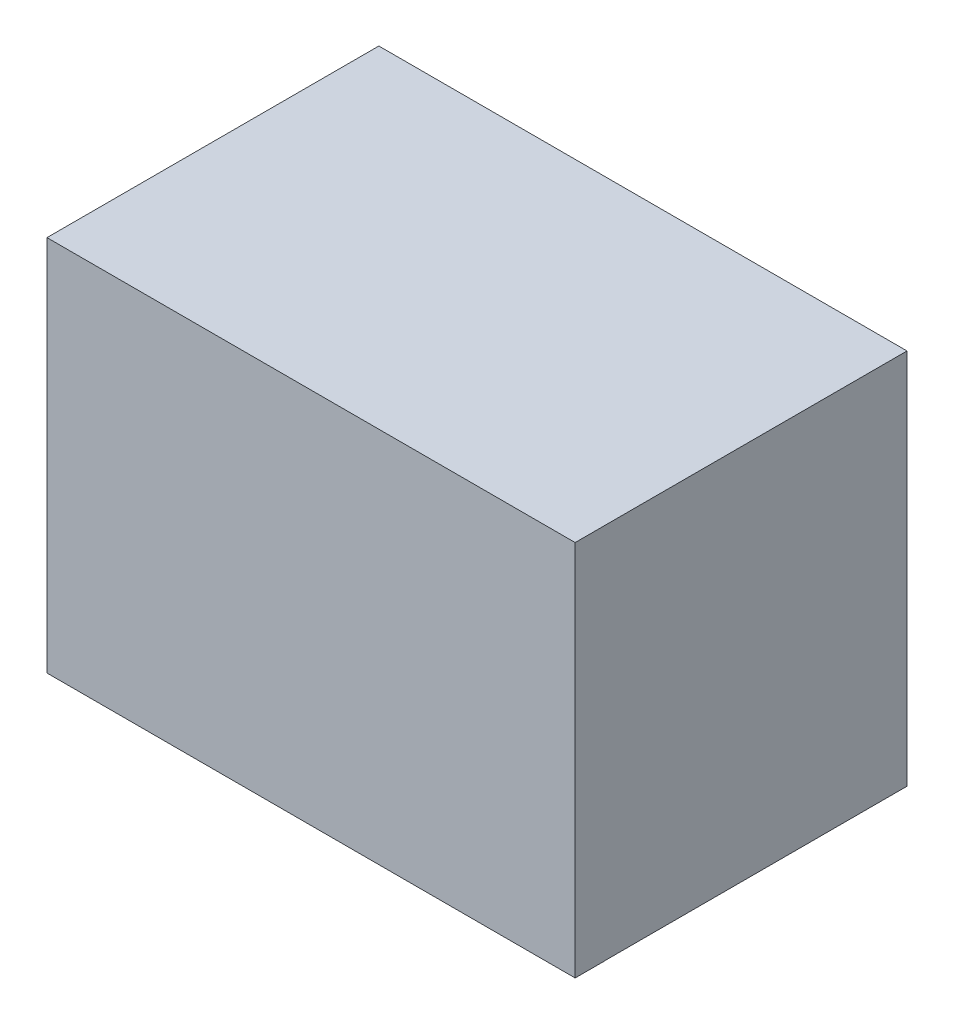
ISO-10303-21;
HEADER;
FILE_DESCRIPTION(('STEP AP214'),'2;1');
FILE_NAME('part.step','',(''),(''),'','','');
FILE_SCHEMA(('AUTOMOTIVE_DESIGN { 1 0 10303 214 1 1 1 1 }'));
ENDSEC;
DATA;
#1=APPLICATION_CONTEXT('core data for automotive mechanical design processes');
#2=APPLICATION_PROTOCOL_DEFINITION('international standard','automotive_design',2000,#1);
#3=PRODUCT_CONTEXT('',#1,'mechanical');
#4=PRODUCT('Part','Part','',(#3));
#5=PRODUCT_RELATED_PRODUCT_CATEGORY('part','',(#4));
#6=PRODUCT_DEFINITION_FORMATION('','',#4);
#7=PRODUCT_DEFINITION_CONTEXT('part definition',#1,'design');
#8=PRODUCT_DEFINITION('design','',#6,#7);
#9=PRODUCT_DEFINITION_SHAPE('','',#8);
#10=(LENGTH_UNIT() NAMED_UNIT(*) SI_UNIT(.MILLI.,.METRE.));
#11=(NAMED_UNIT(*) PLANE_ANGLE_UNIT() SI_UNIT($,.RADIAN.));
#12=(NAMED_UNIT(*) SI_UNIT($,.STERADIAN.) SOLID_ANGLE_UNIT());
#13=UNCERTAINTY_MEASURE_WITH_UNIT(LENGTH_MEASURE(1.E-05),#10,'distance_accuracy_value','');
#14=(GEOMETRIC_REPRESENTATION_CONTEXT(3) GLOBAL_UNCERTAINTY_ASSIGNED_CONTEXT((#13)) GLOBAL_UNIT_ASSIGNED_CONTEXT((#10,
#11,#12)) REPRESENTATION_CONTEXT('',''));
#15=CARTESIAN_POINT('',(0.,0.,0.));
#16=DIRECTION('',(0.,0.,1.));
#17=DIRECTION('',(1.,0.,0.));
#18=AXIS2_PLACEMENT_3D('',#15,#16,#17);
#19=CARTESIAN_POINT('',(-88.9354839762754,-63.4758614942647,-50.8));
#20=DIRECTION('',(-1.,0.,0.));
#21=DIRECTION('',(0.,0.,1.));
#22=AXIS2_PLACEMENT_3D('',#19,#20,#21);
#23=PLANE('',#22);
#24=DIRECTION('',(0.,0.,1.));
#25=VECTOR('',#24,1.);
#26=CARTESIAN_POINT('',(-88.9354839762754,-63.4758614942647,-50.8));
#27=LINE('',#26,#25);
#28=CARTESIAN_POINT('',(-88.9354839762754,-63.4758614942647,-50.8));
#29=VERTEX_POINT('',#28);
#30=CARTESIAN_POINT('',(-88.9354839762754,-63.4758614942647,50.8));
#31=VERTEX_POINT('',#30);
#32=EDGE_CURVE('E216',#29,#31,#27,.T.);
#33=ORIENTED_EDGE('',*,*,#32,.T.);
#34=DIRECTION('',(0.,1.,0.));
#35=VECTOR('',#34,1.);
#36=CARTESIAN_POINT('',(-88.9354839762754,-63.5241385057352,50.8));
#37=LINE('',#36,#35);
#38=CARTESIAN_POINT('',(-88.9354839762754,-63.5241385057352,50.8));
#39=VERTEX_POINT('',#38);
#40=EDGE_CURVE('E180',#39,#31,#37,.T.);
#41=ORIENTED_EDGE('',*,*,#40,.F.);
#42=DIRECTION('',(0.,0.,1.));
#43=VECTOR('',#42,1.);
#44=CARTESIAN_POINT('',(-88.9354839762754,-63.5241385057352,60.9633156210101));
#45=LINE('',#44,#43);
#46=CARTESIAN_POINT('',(-88.9354839762754,-63.5241385057352,60.9633156210101));
#47=VERTEX_POINT('',#46);
#48=EDGE_CURVE('E171',#39,#47,#45,.T.);
#49=ORIENTED_EDGE('',*,*,#48,.T.);
#50=DIRECTION('',(0.,1.,0.));
#51=VECTOR('',#50,1.);
#52=CARTESIAN_POINT('',(-88.9354839762754,-63.5241385057352,60.9633156210101));
#53=LINE('',#52,#51);
#54=CARTESIAN_POINT('',(-88.9354839762754,63.4758614942647,60.9633156210101));
#55=VERTEX_POINT('',#54);
#56=EDGE_CURVE('E155',#47,#55,#53,.T.);
#57=ORIENTED_EDGE('',*,*,#56,.T.);
#58=DIRECTION('',(0.,0.,1.));
#59=VECTOR('',#58,1.);
#60=CARTESIAN_POINT('',(-88.9354839762754,63.4758614942647,-50.8));
#61=LINE('',#60,#59);
#62=CARTESIAN_POINT('',(-88.9354839762754,63.4758614942647,-50.8));
#63=VERTEX_POINT('',#62);
#64=EDGE_CURVE('E221',#63,#55,#61,.T.);
#65=ORIENTED_EDGE('',*,*,#64,.F.);
#66=DIRECTION('',(0.,-1.,0.));
#67=VECTOR('',#66,1.);
#68=CARTESIAN_POINT('',(-88.9354839762754,-63.4758614942647,-50.8));
#69=LINE('',#68,#67);
#70=EDGE_CURVE('E206',#63,#29,#69,.T.);
#71=ORIENTED_EDGE('',*,*,#70,.T.);
#72=EDGE_LOOP('',(#33,#41,#49,#57,#65,#71));
#73=FACE_BOUND('',#72,.T.);
#74=ADVANCED_FACE('F39',(#73),#23,.T.);
#75=CARTESIAN_POINT('',(88.9354839762754,63.4758614942647,-50.8));
#76=DIRECTION('',(0.,1.,0.));
#77=DIRECTION('',(0.,0.,1.));
#78=AXIS2_PLACEMENT_3D('',#75,#76,#77);
#79=PLANE('',#78);
#80=ORIENTED_EDGE('',*,*,#64,.T.);
#81=DIRECTION('',(1.,0.,0.));
#82=VECTOR('',#81,1.);
#83=CARTESIAN_POINT('',(88.9354839762754,63.4758614942647,60.9633156210101));
#84=LINE('',#83,#82);
#85=CARTESIAN_POINT('',(88.9354839762754,63.4758614942647,60.9633156210101));
#86=VERTEX_POINT('',#85);
#87=EDGE_CURVE('E160',#55,#86,#84,.T.);
#88=ORIENTED_EDGE('',*,*,#87,.T.);
#89=DIRECTION('',(0.,0.,1.));
#90=VECTOR('',#89,1.);
#91=CARTESIAN_POINT('',(88.9354839762754,63.4758614942647,-50.8));
#92=LINE('',#91,#90);
#93=CARTESIAN_POINT('',(88.9354839762754,63.4758614942647,-50.8));
#94=VERTEX_POINT('',#93);
#95=EDGE_CURVE('E223',#94,#86,#92,.T.);
#96=ORIENTED_EDGE('',*,*,#95,.F.);
#97=DIRECTION('',(-1.,0.,0.));
#98=VECTOR('',#97,1.);
#99=CARTESIAN_POINT('',(88.9354839762754,63.4758614942647,-50.8));
#100=LINE('',#99,#98);
#101=EDGE_CURVE('E219',#94,#63,#100,.T.);
#102=ORIENTED_EDGE('',*,*,#101,.T.);
#103=EDGE_LOOP('',(#80,#88,#96,#102));
#104=FACE_BOUND('',#103,.T.);
#105=ADVANCED_FACE('F370',(#104),#79,.T.);
#106=CARTESIAN_POINT('',(88.9354839762754,-63.4758614942647,-50.8));
#107=DIRECTION('',(1.,0.,0.));
#108=DIRECTION('',(0.,0.,-1.));
#109=AXIS2_PLACEMENT_3D('',#106,#107,#108);
#110=PLANE('',#109);
#111=ORIENTED_EDGE('',*,*,#95,.T.);
#112=DIRECTION('',(0.,1.,0.));
#113=VECTOR('',#112,1.);
#114=CARTESIAN_POINT('',(88.9354839762754,-63.5241385057352,60.9633156210101));
#115=LINE('',#114,#113);
#116=CARTESIAN_POINT('',(88.9354839762754,-63.5241385057352,60.9633156210101));
#117=VERTEX_POINT('',#116);
#118=EDGE_CURVE('E161',#117,#86,#115,.T.);
#119=ORIENTED_EDGE('',*,*,#118,.F.);
#120=DIRECTION('',(0.,0.,-1.));
#121=VECTOR('',#120,1.);
#122=CARTESIAN_POINT('',(88.9354839762754,-63.5241385057352,60.9633156210101));
#123=LINE('',#122,#121);
#124=CARTESIAN_POINT('',(88.9354839762754,-63.5241385057352,50.8));
#125=VERTEX_POINT('',#124);
#126=EDGE_CURVE('E172',#117,#125,#123,.T.);
#127=ORIENTED_EDGE('',*,*,#126,.T.);
#128=DIRECTION('',(0.,1.,0.));
#129=VECTOR('',#128,1.);
#130=CARTESIAN_POINT('',(88.9354839762754,-63.5241385057352,50.8));
#131=LINE('',#130,#129);
#132=CARTESIAN_POINT('',(88.9354839762754,-63.4758614942647,50.8));
#133=VERTEX_POINT('',#132);
#134=EDGE_CURVE('E183',#125,#133,#131,.T.);
#135=ORIENTED_EDGE('',*,*,#134,.T.);
#136=DIRECTION('',(0.,0.,1.));
#137=VECTOR('',#136,1.);
#138=CARTESIAN_POINT('',(88.9354839762754,-63.4758614942647,-50.8));
#139=LINE('',#138,#137);
#140=CARTESIAN_POINT('',(88.9354839762754,-63.4758614942647,-50.8));
#141=VERTEX_POINT('',#140);
#142=EDGE_CURVE('E228',#141,#133,#139,.T.);
#143=ORIENTED_EDGE('',*,*,#142,.F.);
#144=DIRECTION('',(0.,1.,0.));
#145=VECTOR('',#144,1.);
#146=CARTESIAN_POINT('',(88.9354839762754,-63.4758614942647,-50.8));
#147=LINE('',#146,#145);
#148=EDGE_CURVE('E211',#141,#94,#147,.T.);
#149=ORIENTED_EDGE('',*,*,#148,.T.);
#150=EDGE_LOOP('',(#111,#119,#127,#135,#143,#149));
#151=FACE_BOUND('',#150,.T.);
#152=ADVANCED_FACE('F373',(#151),#110,.T.);
#153=CARTESIAN_POINT('',(88.9354839762754,-63.4758614942647,-50.8));
#154=DIRECTION('',(0.,-1.,0.));
#155=DIRECTION('',(0.,0.,-1.));
#156=AXIS2_PLACEMENT_3D('',#153,#154,#155);
#157=PLANE('',#156);
#158=ORIENTED_EDGE('',*,*,#142,.T.);
#159=DIRECTION('',(1.,0.,0.));
#160=VECTOR('',#159,1.);
#161=CARTESIAN_POINT('',(88.9354839762754,-63.4758614942647,50.8));
#162=LINE('',#161,#160);
#163=EDGE_CURVE('E205',#31,#133,#162,.T.);
#164=ORIENTED_EDGE('',*,*,#163,.F.);
#165=ORIENTED_EDGE('',*,*,#32,.F.);
#166=DIRECTION('',(1.,0.,0.));
#167=VECTOR('',#166,1.);
#168=CARTESIAN_POINT('',(88.9354839762754,-63.4758614942647,-50.8));
#169=LINE('',#168,#167);
#170=EDGE_CURVE('E212',#29,#141,#169,.T.);
#171=ORIENTED_EDGE('',*,*,#170,.T.);
#172=EDGE_LOOP('',(#158,#164,#165,#171));
#173=FACE_BOUND('',#172,.T.);
#174=ADVANCED_FACE('F377',(#173),#157,.T.);
#175=CARTESIAN_POINT('',(0.,0.,-50.8));
#176=DIRECTION('',(0.,0.,1.));
#177=DIRECTION('',(1.,0.,0.));
#178=AXIS2_PLACEMENT_3D('',#175,#176,#177);
#179=PLANE('',#178);
#180=CARTESIAN_POINT('',(-7.62,0.,-50.8));
#181=DIRECTION('',(0.,0.,1.));
#182=DIRECTION('',(1.,0.,0.));
#183=AXIS2_PLACEMENT_3D('',#180,#181,#182);
#184=CIRCLE('',#183,3.175);
#185=CARTESIAN_POINT('',(-4.445,0.,-50.8));
#186=VERTEX_POINT('',#185);
#187=EDGE_CURVE('E189',#186,#186,#184,.F.);
#188=ORIENTED_EDGE('',*,*,#187,.F.);
#189=EDGE_LOOP('',(#188));
#190=FACE_BOUND('',#189,.T.);
#191=CARTESIAN_POINT('',(-25.4,0.,-50.8));
#192=DIRECTION('',(0.,0.,1.));
#193=DIRECTION('',(1.,0.,0.));
#194=AXIS2_PLACEMENT_3D('',#191,#192,#193);
#195=CIRCLE('',#194,1.5875);
#196=CARTESIAN_POINT('',(-23.8125,0.,-50.8));
#197=VERTEX_POINT('',#196);
#198=EDGE_CURVE('E195',#197,#197,#195,.F.);
#199=ORIENTED_EDGE('',*,*,#198,.F.);
#200=EDGE_LOOP('',(#199));
#201=FACE_BOUND('',#200,.T.);
#202=ORIENTED_EDGE('',*,*,#70,.F.);
#203=ORIENTED_EDGE('',*,*,#101,.F.);
#204=ORIENTED_EDGE('',*,*,#148,.F.);
#205=ORIENTED_EDGE('',*,*,#170,.F.);
#206=EDGE_LOOP('',(#202,#203,#204,#205));
#207=FACE_BOUND('',#206,.T.);
#208=ADVANCED_FACE('F450',(#190,#201,#207),#179,.F.);
#209=CARTESIAN_POINT('',(76.2541872337562,-50.7409260868818,-38.0999999999999));
#210=DIRECTION('',(1.,0.,0.));
#211=DIRECTION('',(0.,0.,-1.));
#212=AXIS2_PLACEMENT_3D('',#209,#210,#211);
#213=PLANE('',#212);
#214=DIRECTION('',(0.,1.,0.));
#215=VECTOR('',#214,1.);
#216=CARTESIAN_POINT('',(76.2541872337562,-50.7409260868818,-25.3999999999999));
#217=LINE('',#216,#215);
#218=CARTESIAN_POINT('',(76.2541872337562,38.0409260868818,-25.3999999999999));
#219=VERTEX_POINT('',#218);
#220=CARTESIAN_POINT('',(76.2541872337562,-38.0409260868818,-25.3999999999999));
#221=VERTEX_POINT('',#220);
#222=EDGE_CURVE('E57',#219,#221,#217,.F.);
#223=ORIENTED_EDGE('',*,*,#222,.T.);
#224=DIRECTION('',(0.,0.,1.));
#225=VECTOR('',#224,1.);
#226=CARTESIAN_POINT('',(76.2541872337562,-38.0409260868818,50.8));
#227=LINE('',#226,#225);
#228=CARTESIAN_POINT('',(76.2541872337562,-38.0409260868818,50.8));
#229=VERTEX_POINT('',#228);
#230=EDGE_CURVE('E259',#221,#229,#227,.T.);
#231=ORIENTED_EDGE('',*,*,#230,.T.);
#232=DIRECTION('',(0.,1.,0.));
#233=VECTOR('',#232,1.);
#234=CARTESIAN_POINT('',(76.2541872337562,-50.7409260868818,50.8));
#235=LINE('',#234,#233);
#236=CARTESIAN_POINT('',(76.2541872337562,38.0409260868818,50.8));
#237=VERTEX_POINT('',#236);
#238=EDGE_CURVE('E198',#229,#237,#235,.T.);
#239=ORIENTED_EDGE('',*,*,#238,.T.);
#240=DIRECTION('',(0.,0.,1.));
#241=VECTOR('',#240,1.);
#242=CARTESIAN_POINT('',(76.2541872337562,38.0409260868818,-38.0999999999999));
#243=LINE('',#242,#241);
#244=EDGE_CURVE('E62',#237,#219,#243,.F.);
#245=ORIENTED_EDGE('',*,*,#244,.T.);
#246=EDGE_LOOP('',(#223,#231,#239,#245));
#247=FACE_BOUND('',#246,.T.);
#248=ADVANCED_FACE('F347',(#247),#213,.F.);
#249=CARTESIAN_POINT('',(-76.2541872337562,-50.7409260868818,-38.0999999999999));
#250=DIRECTION('',(0.,-1.,0.));
#251=DIRECTION('',(0.,0.,-1.));
#252=AXIS2_PLACEMENT_3D('',#249,#250,#251);
#253=PLANE('',#252);
#254=DIRECTION('',(1.,0.,0.));
#255=VECTOR('',#254,1.);
#256=CARTESIAN_POINT('',(-76.2541872337562,-50.7409260868818,-25.3999999999999));
#257=LINE('',#256,#255);
#258=CARTESIAN_POINT('',(63.5541872337562,-50.7409260868818,-25.3999999999999));
#259=VERTEX_POINT('',#258);
#260=CARTESIAN_POINT('',(-63.5541872337562,-50.7409260868818,-25.3999999999999));
#261=VERTEX_POINT('',#260);
#262=EDGE_CURVE('E229',#259,#261,#257,.F.);
#263=ORIENTED_EDGE('',*,*,#262,.T.);
#264=DIRECTION('',(0.,0.,1.));
#265=VECTOR('',#264,1.);
#266=CARTESIAN_POINT('',(-63.5541872337562,-50.7409260868818,50.8));
#267=LINE('',#266,#265);
#268=CARTESIAN_POINT('',(-63.5541872337562,-50.7409260868818,50.8));
#269=VERTEX_POINT('',#268);
#270=EDGE_CURVE('E235',#261,#269,#267,.T.);
#271=ORIENTED_EDGE('',*,*,#270,.T.);
#272=DIRECTION('',(1.,0.,0.));
#273=VECTOR('',#272,1.);
#274=CARTESIAN_POINT('',(-76.2541872337562,-50.7409260868818,50.8));
#275=LINE('',#274,#273);
#276=CARTESIAN_POINT('',(63.5541872337562,-50.7409260868818,50.8));
#277=VERTEX_POINT('',#276);
#278=EDGE_CURVE('E204',#269,#277,#275,.T.);
#279=ORIENTED_EDGE('',*,*,#278,.T.);
#280=DIRECTION('',(0.,0.,1.));
#281=VECTOR('',#280,1.);
#282=CARTESIAN_POINT('',(63.5541872337562,-50.7409260868818,-38.0999999999999));
#283=LINE('',#282,#281);
#284=EDGE_CURVE('E224',#277,#259,#283,.F.);
#285=ORIENTED_EDGE('',*,*,#284,.T.);
#286=EDGE_LOOP('',(#263,#271,#279,#285));
#287=FACE_BOUND('',#286,.T.);
#288=ADVANCED_FACE('F530',(#287),#253,.F.);
#289=CARTESIAN_POINT('',(-76.2541872337562,-50.7409260868818,-38.0999999999999));
#290=DIRECTION('',(-1.,0.,0.));
#291=DIRECTION('',(0.,0.,1.));
#292=AXIS2_PLACEMENT_3D('',#289,#290,#291);
#293=PLANE('',#292);
#294=DIRECTION('',(0.,-1.,0.));
#295=VECTOR('',#294,1.);
#296=CARTESIAN_POINT('',(-76.2541872337562,-50.7409260868818,50.8));
#297=LINE('',#296,#295);
#298=CARTESIAN_POINT('',(-76.2541872337562,38.0409260868818,50.8));
#299=VERTEX_POINT('',#298);
#300=CARTESIAN_POINT('',(-76.2541872337562,-38.0409260868818,50.8));
#301=VERTEX_POINT('',#300);
#302=EDGE_CURVE('E201',#299,#301,#297,.T.);
#303=ORIENTED_EDGE('',*,*,#302,.T.);
#304=DIRECTION('',(0.,0.,1.));
#305=VECTOR('',#304,1.);
#306=CARTESIAN_POINT('',(-76.2541872337562,-38.0409260868818,-38.0999999999999));
#307=LINE('',#306,#305);
#308=CARTESIAN_POINT('',(-76.2541872337562,-38.0409260868818,-25.3999999999999));
#309=VERTEX_POINT('',#308);
#310=EDGE_CURVE('E237',#301,#309,#307,.F.);
#311=ORIENTED_EDGE('',*,*,#310,.T.);
#312=DIRECTION('',(0.,-1.,0.));
#313=VECTOR('',#312,1.);
#314=CARTESIAN_POINT('',(-76.2541872337562,50.7409260868818,-25.3999999999999));
#315=LINE('',#314,#313);
#316=CARTESIAN_POINT('',(-76.2541872337562,38.0409260868818,-25.3999999999999));
#317=VERTEX_POINT('',#316);
#318=EDGE_CURVE('E240',#309,#317,#315,.F.);
#319=ORIENTED_EDGE('',*,*,#318,.T.);
#320=DIRECTION('',(0.,0.,1.));
#321=VECTOR('',#320,1.);
#322=CARTESIAN_POINT('',(-76.2541872337562,38.0409260868818,50.8));
#323=LINE('',#322,#321);
#324=EDGE_CURVE('E232',#317,#299,#323,.T.);
#325=ORIENTED_EDGE('',*,*,#324,.T.);
#326=EDGE_LOOP('',(#303,#311,#319,#325));
#327=FACE_BOUND('',#326,.T.);
#328=ADVANCED_FACE('F531',(#327),#293,.F.);
#329=CARTESIAN_POINT('',(-76.2541872337562,50.7409260868818,-38.0999999999999));
#330=DIRECTION('',(0.,1.,0.));
#331=DIRECTION('',(0.,0.,1.));
#332=AXIS2_PLACEMENT_3D('',#329,#330,#331);
#333=PLANE('',#332);
#334=DIRECTION('',(-1.,0.,0.));
#335=VECTOR('',#334,1.);
#336=CARTESIAN_POINT('',(76.2541872337562,50.7409260868818,-25.3999999999999));
#337=LINE('',#336,#335);
#338=CARTESIAN_POINT('',(-63.5541872337562,50.7409260868818,-25.3999999999999));
#339=VERTEX_POINT('',#338);
#340=CARTESIAN_POINT('',(63.5541872337562,50.7409260868818,-25.3999999999999));
#341=VERTEX_POINT('',#340);
#342=EDGE_CURVE('E255',#339,#341,#337,.F.);
#343=ORIENTED_EDGE('',*,*,#342,.T.);
#344=DIRECTION('',(0.,0.,1.));
#345=VECTOR('',#344,1.);
#346=CARTESIAN_POINT('',(63.5541872337562,50.7409260868818,50.8));
#347=LINE('',#346,#345);
#348=CARTESIAN_POINT('',(63.5541872337562,50.7409260868818,50.8));
#349=VERTEX_POINT('',#348);
#350=EDGE_CURVE('E251',#341,#349,#347,.T.);
#351=ORIENTED_EDGE('',*,*,#350,.T.);
#352=DIRECTION('',(-1.,0.,0.));
#353=VECTOR('',#352,1.);
#354=CARTESIAN_POINT('',(-76.2541872337562,50.7409260868818,50.8));
#355=LINE('',#354,#353);
#356=CARTESIAN_POINT('',(-63.5541872337562,50.7409260868818,50.8));
#357=VERTEX_POINT('',#356);
#358=EDGE_CURVE('E197',#349,#357,#355,.T.);
#359=ORIENTED_EDGE('',*,*,#358,.T.);
#360=DIRECTION('',(0.,0.,1.));
#361=VECTOR('',#360,1.);
#362=CARTESIAN_POINT('',(-63.5541872337562,50.7409260868818,-38.0999999999999));
#363=LINE('',#362,#361);
#364=EDGE_CURVE('E249',#357,#339,#363,.F.);
#365=ORIENTED_EDGE('',*,*,#364,.T.);
#366=EDGE_LOOP('',(#343,#351,#359,#365));
#367=FACE_BOUND('',#366,.T.);
#368=ADVANCED_FACE('F307',(#367),#333,.F.);
#369=CARTESIAN_POINT('',(0.,0.,-38.0999999999999));
#370=DIRECTION('',(0.,0.,-1.));
#371=DIRECTION('',(-1.,0.,0.));
#372=AXIS2_PLACEMENT_3D('',#369,#370,#371);
#373=PLANE('',#372);
#374=CARTESIAN_POINT('',(-7.62,0.,-38.0999999999999));
#375=DIRECTION('',(0.,0.,-1.));
#376=DIRECTION('',(-1.,0.,0.));
#377=AXIS2_PLACEMENT_3D('',#374,#375,#376);
#378=CIRCLE('',#377,3.175);
#379=CARTESIAN_POINT('',(-10.795,0.,-38.0999999999999));
#380=VERTEX_POINT('',#379);
#381=EDGE_CURVE('E43',#380,#380,#378,.F.);
#382=ORIENTED_EDGE('',*,*,#381,.F.);
#383=EDGE_LOOP('',(#382));
#384=FACE_BOUND('',#383,.T.);
#385=CARTESIAN_POINT('',(-25.4,0.,-38.0999999999999));
#386=DIRECTION('',(0.,0.,-1.));
#387=DIRECTION('',(-1.,0.,0.));
#388=AXIS2_PLACEMENT_3D('',#385,#386,#387);
#389=CIRCLE('',#388,1.5875);
#390=CARTESIAN_POINT('',(-26.9875,0.,-38.0999999999999));
#391=VERTEX_POINT('',#390);
#392=EDGE_CURVE('E192',#391,#391,#389,.F.);
#393=ORIENTED_EDGE('',*,*,#392,.F.);
#394=EDGE_LOOP('',(#393));
#395=FACE_BOUND('',#394,.T.);
#396=DIRECTION('',(-1.,0.,0.));
#397=VECTOR('',#396,1.);
#398=CARTESIAN_POINT('',(-76.2541872337562,38.0409260868818,-38.0999999999999));
#399=LINE('',#398,#397);
#400=CARTESIAN_POINT('',(63.5541872337562,38.0409260868818,-38.0999999999999));
#401=VERTEX_POINT('',#400);
#402=CARTESIAN_POINT('',(-63.5541872337562,38.0409260868818,-38.0999999999999));
#403=VERTEX_POINT('',#402);
#404=EDGE_CURVE('E244',#401,#403,#399,.T.);
#405=ORIENTED_EDGE('',*,*,#404,.T.);
#406=DIRECTION('',(0.,-1.,0.));
#407=VECTOR('',#406,1.);
#408=CARTESIAN_POINT('',(-63.5541872337562,-50.7409260868818,-38.0999999999999));
#409=LINE('',#408,#407);
#410=CARTESIAN_POINT('',(-63.5541872337562,-38.0409260868818,-38.0999999999999));
#411=VERTEX_POINT('',#410);
#412=EDGE_CURVE('E250',#403,#411,#409,.T.);
#413=ORIENTED_EDGE('',*,*,#412,.T.);
#414=DIRECTION('',(1.,0.,0.));
#415=VECTOR('',#414,1.);
#416=CARTESIAN_POINT('',(76.2541872337562,-38.0409260868818,-38.0999999999999));
#417=LINE('',#416,#415);
#418=CARTESIAN_POINT('',(63.5541872337562,-38.0409260868818,-38.0999999999999));
#419=VERTEX_POINT('',#418);
#420=EDGE_CURVE('E241',#411,#419,#417,.T.);
#421=ORIENTED_EDGE('',*,*,#420,.T.);
#422=DIRECTION('',(0.,1.,0.));
#423=VECTOR('',#422,1.);
#424=CARTESIAN_POINT('',(63.5541872337562,50.7409260868818,-38.0999999999999));
#425=LINE('',#424,#423);
#426=EDGE_CURVE('E243',#419,#401,#425,.T.);
#427=ORIENTED_EDGE('',*,*,#426,.T.);
#428=EDGE_LOOP('',(#405,#413,#421,#427));
#429=FACE_BOUND('',#428,.T.);
#430=ADVANCED_FACE('F306',(#384,#395,#429),#373,.F.);
#431=CARTESIAN_POINT('',(63.5541872337562,38.0409260868818,-38.0999999999999));
#432=DIRECTION('',(0.,0.,-1.));
#433=DIRECTION('',(-1.,0.,0.));
#434=AXIS2_PLACEMENT_3D('',#431,#432,#433);
#435=CYLINDRICAL_SURFACE('',#434,12.7);
#436=CARTESIAN_POINT('',(63.5541872337562,38.0409260868818,-25.3999999999999));
#437=DIRECTION('',(0.,0.,1.));
#438=DIRECTION('',(1.,0.,0.));
#439=AXIS2_PLACEMENT_3D('',#436,#437,#438);
#440=CIRCLE('',#439,12.7);
#441=EDGE_CURVE('E200',#219,#341,#440,.T.);
#442=ORIENTED_EDGE('',*,*,#441,.F.);
#443=ORIENTED_EDGE('',*,*,#244,.F.);
#444=CARTESIAN_POINT('',(63.5541872337562,38.0409260868818,50.8));
#445=DIRECTION('',(0.,0.,1.));
#446=DIRECTION('',(1.,0.,0.));
#447=AXIS2_PLACEMENT_3D('',#444,#445,#446);
#448=CIRCLE('',#447,12.7);
#449=EDGE_CURVE('E48',#349,#237,#448,.F.);
#450=ORIENTED_EDGE('',*,*,#449,.F.);
#451=ORIENTED_EDGE('',*,*,#350,.F.);
#452=EDGE_LOOP('',(#442,#443,#450,#451));
#453=FACE_BOUND('',#452,.T.);
#454=ADVANCED_FACE('F41',(#453),#435,.F.);
#455=CARTESIAN_POINT('',(63.5541872337562,38.0409260868818,-25.3999999999999));
#456=DIRECTION('',(0.,1.,0.));
#457=DIRECTION('',(-1.,0.,0.));
#458=AXIS2_PLACEMENT_3D('',#455,#456,#457);
#459=SPHERICAL_SURFACE('',#458,12.7);
#460=CARTESIAN_POINT('',(63.5541872337562,38.0409260868818,-25.3999999999999));
#461=DIRECTION('',(0.,-1.,0.));
#462=DIRECTION('',(0.,0.,-1.));
#463=AXIS2_PLACEMENT_3D('',#460,#461,#462);
#464=CIRCLE('',#463,12.7);
#465=EDGE_CURVE('E291',#219,#401,#464,.F.);
#466=ORIENTED_EDGE('',*,*,#465,.F.);
#467=ORIENTED_EDGE('',*,*,#441,.T.);
#468=CARTESIAN_POINT('',(63.5541872337562,38.0409260868818,-25.3999999999999));
#469=DIRECTION('',(-1.,0.,0.));
#470=DIRECTION('',(0.,0.,1.));
#471=AXIS2_PLACEMENT_3D('',#468,#469,#470);
#472=CIRCLE('',#471,12.7);
#473=EDGE_CURVE('E298',#401,#341,#472,.F.);
#474=ORIENTED_EDGE('',*,*,#473,.F.);
#475=EDGE_LOOP('',(#466,#467,#474));
#476=FACE_BOUND('',#475,.T.);
#477=ADVANCED_FACE('F358',(#476),#459,.F.);
#478=CARTESIAN_POINT('',(-63.5541872337562,38.0409260868818,-38.0999999999999));
#479=DIRECTION('',(0.,0.,-1.));
#480=DIRECTION('',(-1.,0.,0.));
#481=AXIS2_PLACEMENT_3D('',#478,#479,#480);
#482=CYLINDRICAL_SURFACE('',#481,12.7);
#483=CARTESIAN_POINT('',(-63.5541872337562,38.0409260868818,50.8));
#484=DIRECTION('',(0.,0.,1.));
#485=DIRECTION('',(1.,0.,0.));
#486=AXIS2_PLACEMENT_3D('',#483,#484,#485);
#487=CIRCLE('',#486,12.7);
#488=EDGE_CURVE('E11',#299,#357,#487,.F.);
#489=ORIENTED_EDGE('',*,*,#488,.F.);
#490=ORIENTED_EDGE('',*,*,#324,.F.);
#491=CARTESIAN_POINT('',(-63.5541872337562,38.0409260868818,-25.3999999999999));
#492=DIRECTION('',(0.,0.,1.));
#493=DIRECTION('',(1.,0.,0.));
#494=AXIS2_PLACEMENT_3D('',#491,#492,#493);
#495=CIRCLE('',#494,12.7);
#496=EDGE_CURVE('E290',#339,#317,#495,.T.);
#497=ORIENTED_EDGE('',*,*,#496,.F.);
#498=ORIENTED_EDGE('',*,*,#364,.F.);
#499=EDGE_LOOP('',(#489,#490,#497,#498));
#500=FACE_BOUND('',#499,.T.);
#501=ADVANCED_FACE('F356',(#500),#482,.F.);
#502=CARTESIAN_POINT('',(0.,38.0409260868818,-25.3999999999999));
#503=DIRECTION('',(1.,0.,0.));
#504=DIRECTION('',(0.,0.,-1.));
#505=AXIS2_PLACEMENT_3D('',#502,#503,#504);
#506=CYLINDRICAL_SURFACE('',#505,12.7);
#507=ORIENTED_EDGE('',*,*,#473,.T.);
#508=ORIENTED_EDGE('',*,*,#342,.F.);
#509=CARTESIAN_POINT('',(-63.5541872337562,38.0409260868818,-25.3999999999999));
#510=DIRECTION('',(1.,0.,0.));
#511=DIRECTION('',(0.,0.,-1.));
#512=AXIS2_PLACEMENT_3D('',#509,#510,#511);
#513=CIRCLE('',#512,12.7);
#514=EDGE_CURVE('E287',#403,#339,#513,.T.);
#515=ORIENTED_EDGE('',*,*,#514,.F.);
#516=ORIENTED_EDGE('',*,*,#404,.F.);
#517=EDGE_LOOP('',(#507,#508,#515,#516));
#518=FACE_BOUND('',#517,.T.);
#519=ADVANCED_FACE('F316',(#518),#506,.F.);
#520=CARTESIAN_POINT('',(63.5541872337562,0.,-25.3999999999999));
#521=DIRECTION('',(0.,-1.,0.));
#522=DIRECTION('',(0.,0.,-1.));
#523=AXIS2_PLACEMENT_3D('',#520,#521,#522);
#524=CYLINDRICAL_SURFACE('',#523,12.7);
#525=ORIENTED_EDGE('',*,*,#465,.T.);
#526=ORIENTED_EDGE('',*,*,#426,.F.);
#527=CARTESIAN_POINT('',(63.5541872337562,-38.0409260868818,-25.3999999999999));
#528=DIRECTION('',(0.,1.,0.));
#529=DIRECTION('',(0.,0.,1.));
#530=AXIS2_PLACEMENT_3D('',#527,#528,#529);
#531=CIRCLE('',#530,12.7);
#532=EDGE_CURVE('E285',#221,#419,#531,.T.);
#533=ORIENTED_EDGE('',*,*,#532,.F.);
#534=ORIENTED_EDGE('',*,*,#222,.F.);
#535=EDGE_LOOP('',(#525,#526,#533,#534));
#536=FACE_BOUND('',#535,.T.);
#537=ADVANCED_FACE('F340',(#536),#524,.F.);
#538=CARTESIAN_POINT('',(63.5541872337562,-38.0409260868818,-38.0999999999999));
#539=DIRECTION('',(0.,0.,-1.));
#540=DIRECTION('',(-1.,0.,0.));
#541=AXIS2_PLACEMENT_3D('',#538,#539,#540);
#542=CYLINDRICAL_SURFACE('',#541,12.7);
#543=CARTESIAN_POINT('',(63.5541872337562,-38.0409260868818,50.8));
#544=DIRECTION('',(0.,0.,1.));
#545=DIRECTION('',(1.,0.,0.));
#546=AXIS2_PLACEMENT_3D('',#543,#544,#545);
#547=CIRCLE('',#546,12.7);
#548=EDGE_CURVE('E262',#229,#277,#547,.F.);
#549=ORIENTED_EDGE('',*,*,#548,.F.);
#550=ORIENTED_EDGE('',*,*,#230,.F.);
#551=CARTESIAN_POINT('',(63.5541872337562,-38.0409260868818,-25.3999999999999));
#552=DIRECTION('',(0.,0.,1.));
#553=DIRECTION('',(1.,0.,0.));
#554=AXIS2_PLACEMENT_3D('',#551,#552,#553);
#555=CIRCLE('',#554,12.7);
#556=EDGE_CURVE('E283',#259,#221,#555,.T.);
#557=ORIENTED_EDGE('',*,*,#556,.F.);
#558=ORIENTED_EDGE('',*,*,#284,.F.);
#559=EDGE_LOOP('',(#549,#550,#557,#558));
#560=FACE_BOUND('',#559,.T.);
#561=ADVANCED_FACE('F348',(#560),#542,.F.);
#562=CARTESIAN_POINT('',(-63.5541872337562,38.0409260868818,-25.3999999999999));
#563=DIRECTION('',(0.,1.,0.));
#564=DIRECTION('',(0.,0.,1.));
#565=AXIS2_PLACEMENT_3D('',#562,#563,#564);
#566=SPHERICAL_SURFACE('',#565,12.7);
#567=ORIENTED_EDGE('',*,*,#514,.T.);
#568=ORIENTED_EDGE('',*,*,#496,.T.);
#569=CARTESIAN_POINT('',(-63.5541872337562,38.0409260868818,-25.3999999999999));
#570=DIRECTION('',(0.,-1.,0.));
#571=DIRECTION('',(0.,0.,-1.));
#572=AXIS2_PLACEMENT_3D('',#569,#570,#571);
#573=CIRCLE('',#572,12.7);
#574=EDGE_CURVE('E279',#403,#317,#573,.F.);
#575=ORIENTED_EDGE('',*,*,#574,.F.);
#576=EDGE_LOOP('',(#567,#568,#575));
#577=FACE_BOUND('',#576,.T.);
#578=ADVANCED_FACE('F325',(#577),#566,.F.);
#579=CARTESIAN_POINT('',(63.5541872337562,-38.0409260868818,-25.3999999999999));
#580=DIRECTION('',(1.,0.,0.));
#581=DIRECTION('',(0.,0.,-1.));
#582=AXIS2_PLACEMENT_3D('',#579,#580,#581);
#583=SPHERICAL_SURFACE('',#582,12.7);
#584=ORIENTED_EDGE('',*,*,#556,.T.);
#585=ORIENTED_EDGE('',*,*,#532,.T.);
#586=CARTESIAN_POINT('',(63.5541872337562,-38.0409260868818,-25.3999999999999));
#587=DIRECTION('',(-1.,0.,0.));
#588=DIRECTION('',(0.,0.,1.));
#589=AXIS2_PLACEMENT_3D('',#586,#587,#588);
#590=CIRCLE('',#589,12.7);
#591=EDGE_CURVE('E273',#259,#419,#590,.F.);
#592=ORIENTED_EDGE('',*,*,#591,.F.);
#593=EDGE_LOOP('',(#584,#585,#592));
#594=FACE_BOUND('',#593,.T.);
#595=ADVANCED_FACE('F342',(#594),#583,.F.);
#596=CARTESIAN_POINT('',(-63.5541872337562,0.,-25.3999999999999));
#597=DIRECTION('',(0.,1.,0.));
#598=DIRECTION('',(0.,0.,1.));
#599=AXIS2_PLACEMENT_3D('',#596,#597,#598);
#600=CYLINDRICAL_SURFACE('',#599,12.7);
#601=ORIENTED_EDGE('',*,*,#574,.T.);
#602=ORIENTED_EDGE('',*,*,#318,.F.);
#603=CARTESIAN_POINT('',(-63.5541872337562,-38.0409260868818,-25.3999999999999));
#604=DIRECTION('',(0.,1.,0.));
#605=DIRECTION('',(0.,0.,1.));
#606=AXIS2_PLACEMENT_3D('',#603,#604,#605);
#607=CIRCLE('',#606,12.7);
#608=EDGE_CURVE('E275',#411,#309,#607,.T.);
#609=ORIENTED_EDGE('',*,*,#608,.F.);
#610=ORIENTED_EDGE('',*,*,#412,.F.);
#611=EDGE_LOOP('',(#601,#602,#609,#610));
#612=FACE_BOUND('',#611,.T.);
#613=ADVANCED_FACE('F328',(#612),#600,.F.);
#614=CARTESIAN_POINT('',(0.,-38.0409260868818,-25.3999999999999));
#615=DIRECTION('',(-1.,0.,0.));
#616=DIRECTION('',(0.,0.,1.));
#617=AXIS2_PLACEMENT_3D('',#614,#615,#616);
#618=CYLINDRICAL_SURFACE('',#617,12.7);
#619=ORIENTED_EDGE('',*,*,#591,.T.);
#620=ORIENTED_EDGE('',*,*,#420,.F.);
#621=CARTESIAN_POINT('',(-63.5541872337562,-38.0409260868818,-25.3999999999999));
#622=DIRECTION('',(1.,0.,0.));
#623=DIRECTION('',(0.,0.,-1.));
#624=AXIS2_PLACEMENT_3D('',#621,#622,#623);
#625=CIRCLE('',#624,12.7);
#626=EDGE_CURVE('E270',#261,#411,#625,.T.);
#627=ORIENTED_EDGE('',*,*,#626,.F.);
#628=ORIENTED_EDGE('',*,*,#262,.F.);
#629=EDGE_LOOP('',(#619,#620,#627,#628));
#630=FACE_BOUND('',#629,.T.);
#631=ADVANCED_FACE('F332',(#630),#618,.F.);
#632=CARTESIAN_POINT('',(-63.5541872337562,-38.0409260868818,-25.3999999999999));
#633=DIRECTION('',(0.,0.,-1.));
#634=DIRECTION('',(-1.,0.,0.));
#635=AXIS2_PLACEMENT_3D('',#632,#633,#634);
#636=SPHERICAL_SURFACE('',#635,12.7);
#637=ORIENTED_EDGE('',*,*,#626,.T.);
#638=ORIENTED_EDGE('',*,*,#608,.T.);
#639=CARTESIAN_POINT('',(-63.5541872337562,-38.0409260868818,-25.3999999999999));
#640=DIRECTION('',(0.,0.,1.));
#641=DIRECTION('',(1.,0.,0.));
#642=AXIS2_PLACEMENT_3D('',#639,#640,#641);
#643=CIRCLE('',#642,12.7);
#644=EDGE_CURVE('E193',#261,#309,#643,.F.);
#645=ORIENTED_EDGE('',*,*,#644,.F.);
#646=EDGE_LOOP('',(#637,#638,#645));
#647=FACE_BOUND('',#646,.T.);
#648=ADVANCED_FACE('F384',(#647),#636,.F.);
#649=CARTESIAN_POINT('',(-63.5541872337562,-38.0409260868818,-38.0999999999999));
#650=DIRECTION('',(0.,0.,-1.));
#651=DIRECTION('',(-1.,0.,0.));
#652=AXIS2_PLACEMENT_3D('',#649,#650,#651);
#653=CYLINDRICAL_SURFACE('',#652,12.7);
#654=ORIENTED_EDGE('',*,*,#644,.T.);
#655=ORIENTED_EDGE('',*,*,#310,.F.);
#656=CARTESIAN_POINT('',(-63.5541872337562,-38.0409260868818,50.8));
#657=DIRECTION('',(0.,0.,1.));
#658=DIRECTION('',(1.,0.,0.));
#659=AXIS2_PLACEMENT_3D('',#656,#657,#658);
#660=CIRCLE('',#659,12.7);
#661=EDGE_CURVE('E258',#269,#301,#660,.F.);
#662=ORIENTED_EDGE('',*,*,#661,.F.);
#663=ORIENTED_EDGE('',*,*,#270,.F.);
#664=EDGE_LOOP('',(#654,#655,#662,#663));
#665=FACE_BOUND('',#664,.T.);
#666=ADVANCED_FACE('F379',(#665),#653,.F.);
#667=CARTESIAN_POINT('',(-25.4,0.,100.838));
#668=DIRECTION('',(0.,0.,-1.));
#669=DIRECTION('',(-1.,0.,0.));
#670=AXIS2_PLACEMENT_3D('',#667,#668,#669);
#671=CYLINDRICAL_SURFACE('',#670,1.5875);
#672=ORIENTED_EDGE('',*,*,#392,.T.);
#673=EDGE_LOOP('',(#672));
#674=FACE_BOUND('',#673,.T.);
#675=ORIENTED_EDGE('',*,*,#198,.T.);
#676=EDGE_LOOP('',(#675));
#677=FACE_BOUND('',#676,.T.);
#678=ADVANCED_FACE('F303',(#674,#677),#671,.F.);
#679=CARTESIAN_POINT('',(-7.62,0.,50.8));
#680=DIRECTION('',(0.,0.,-1.));
#681=DIRECTION('',(-1.,0.,0.));
#682=AXIS2_PLACEMENT_3D('',#679,#680,#681);
#683=CYLINDRICAL_SURFACE('',#682,3.175);
#684=ORIENTED_EDGE('',*,*,#381,.T.);
#685=EDGE_LOOP('',(#684));
#686=FACE_BOUND('',#685,.T.);
#687=ORIENTED_EDGE('',*,*,#187,.T.);
#688=EDGE_LOOP('',(#687));
#689=FACE_BOUND('',#688,.T.);
#690=ADVANCED_FACE('F441',(#686,#689),#683,.F.);
#691=CARTESIAN_POINT('',(0.,-63.5241385057352,0.));
#692=DIRECTION('',(0.,1.,0.));
#693=DIRECTION('',(0.,0.,1.));
#694=AXIS2_PLACEMENT_3D('',#691,#692,#693);
#695=PLANE('',#694);
#696=ORIENTED_EDGE('',*,*,#48,.F.);
#697=DIRECTION('',(-1.,0.,0.));
#698=VECTOR('',#697,1.);
#699=CARTESIAN_POINT('',(88.9354839762754,-63.5241385057352,50.8));
#700=LINE('',#699,#698);
#701=EDGE_CURVE('E165',#125,#39,#700,.T.);
#702=ORIENTED_EDGE('',*,*,#701,.F.);
#703=ORIENTED_EDGE('',*,*,#126,.F.);
#704=DIRECTION('',(1.,0.,0.));
#705=VECTOR('',#704,1.);
#706=CARTESIAN_POINT('',(88.9354839762754,-63.5241385057352,60.9633156210101));
#707=LINE('',#706,#705);
#708=EDGE_CURVE('E159',#47,#117,#707,.T.);
#709=ORIENTED_EDGE('',*,*,#708,.F.);
#710=EDGE_LOOP('',(#696,#702,#703,#709));
#711=FACE_BOUND('',#710,.T.);
#712=ADVANCED_FACE('F169',(#711),#695,.F.);
#713=CARTESIAN_POINT('',(88.9354839762754,-63.5241385057352,60.9633156210101));
#714=DIRECTION('',(0.,0.,1.));
#715=DIRECTION('',(1.,0.,0.));
#716=AXIS2_PLACEMENT_3D('',#713,#714,#715);
#717=PLANE('',#716);
#718=ORIENTED_EDGE('',*,*,#87,.F.);
#719=ORIENTED_EDGE('',*,*,#56,.F.);
#720=ORIENTED_EDGE('',*,*,#708,.T.);
#721=ORIENTED_EDGE('',*,*,#118,.T.);
#722=EDGE_LOOP('',(#718,#719,#720,#721));
#723=FACE_BOUND('',#722,.T.);
#724=ADVANCED_FACE('F156',(#723),#717,.T.);
#725=CARTESIAN_POINT('',(88.9354839762754,-63.5241385057352,50.8));
#726=DIRECTION('',(0.,0.,-1.));
#727=DIRECTION('',(-1.,0.,0.));
#728=AXIS2_PLACEMENT_3D('',#725,#726,#727);
#729=PLANE('',#728);
#730=ORIENTED_EDGE('',*,*,#40,.T.);
#731=ORIENTED_EDGE('',*,*,#163,.T.);
#732=ORIENTED_EDGE('',*,*,#134,.F.);
#733=ORIENTED_EDGE('',*,*,#701,.T.);
#734=EDGE_LOOP('',(#730,#731,#732,#733));
#735=FACE_BOUND('',#734,.T.);
#736=ADVANCED_FACE('F509',(#735),#729,.T.);
#737=ORIENTED_EDGE('',*,*,#238,.F.);
#738=ORIENTED_EDGE('',*,*,#548,.T.);
#739=ORIENTED_EDGE('',*,*,#278,.F.);
#740=ORIENTED_EDGE('',*,*,#661,.T.);
#741=ORIENTED_EDGE('',*,*,#302,.F.);
#742=ORIENTED_EDGE('',*,*,#488,.T.);
#743=ORIENTED_EDGE('',*,*,#358,.F.);
#744=ORIENTED_EDGE('',*,*,#449,.T.);
#745=EDGE_LOOP('',(#737,#738,#739,#740,#741,#742,#743,#744));
#746=FACE_BOUND('',#745,.T.);
#747=ADVANCED_FACE('F352',(#746),#729,.T.);
#748=CLOSED_SHELL('',(#74,#105,#152,#174,#208,#248,#288,#328,#368,#430,#454,#477,#501,#519,#537,
#561,#578,#595,#613,#631,#648,#666,#678,#690,#712,#724,#736,#747));
#749=MANIFOLD_SOLID_BREP('B2',#748);
#750=ADVANCED_BREP_SHAPE_REPRESENTATION('',(#18,#749),#14);
#751=SHAPE_DEFINITION_REPRESENTATION(#9,#750);
ENDSEC;
END-ISO-10303-21;
